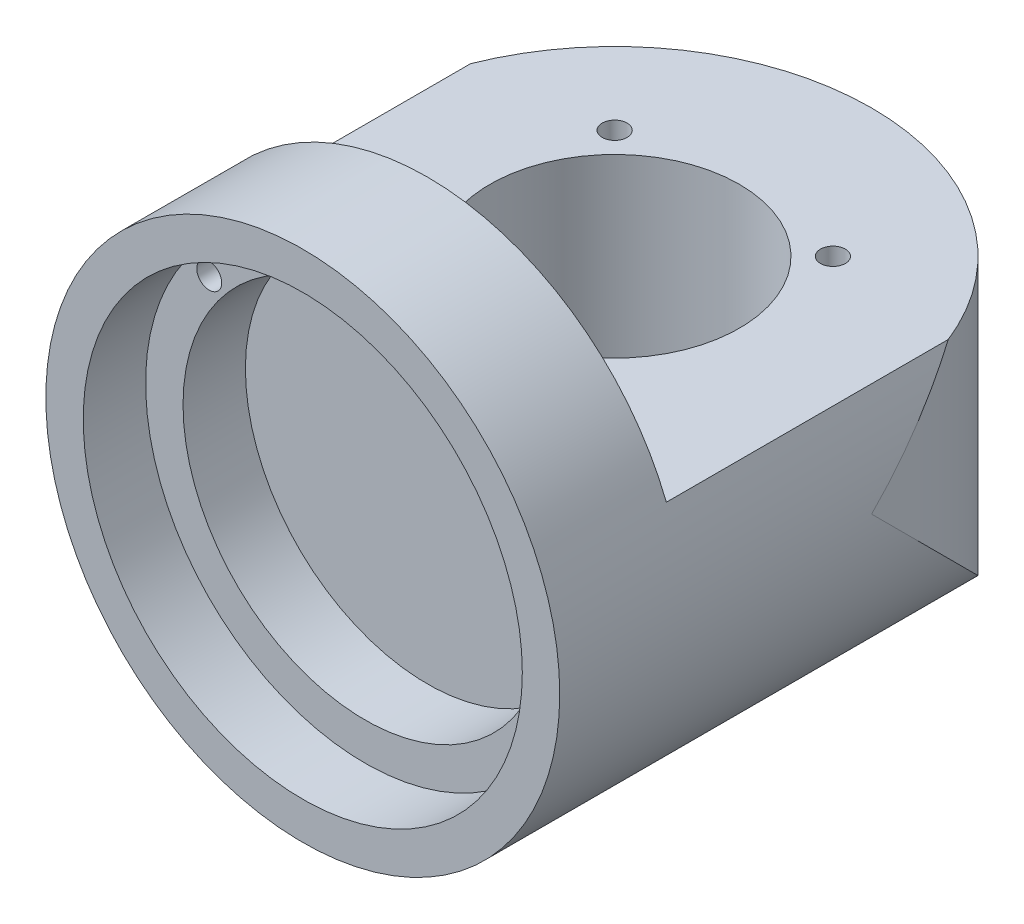
ISO-10303-21;
HEADER;
FILE_DESCRIPTION(('STEP AP214'),'2;1');
FILE_NAME('part.step','',(''),(''),'','','');
FILE_SCHEMA(('AUTOMOTIVE_DESIGN { 1 0 10303 214 1 1 1 1 }'));
ENDSEC;
DATA;
#1=APPLICATION_CONTEXT('core data for automotive mechanical design processes');
#2=APPLICATION_PROTOCOL_DEFINITION('international standard','automotive_design',2000,#1);
#3=PRODUCT_CONTEXT('',#1,'mechanical');
#4=PRODUCT('Part','Part','',(#3));
#5=PRODUCT_RELATED_PRODUCT_CATEGORY('part','',(#4));
#6=PRODUCT_DEFINITION_FORMATION('','',#4);
#7=PRODUCT_DEFINITION_CONTEXT('part definition',#1,'design');
#8=PRODUCT_DEFINITION('design','',#6,#7);
#9=PRODUCT_DEFINITION_SHAPE('','',#8);
#10=(LENGTH_UNIT() NAMED_UNIT(*) SI_UNIT(.MILLI.,.METRE.));
#11=(NAMED_UNIT(*) PLANE_ANGLE_UNIT() SI_UNIT($,.RADIAN.));
#12=(NAMED_UNIT(*) SI_UNIT($,.STERADIAN.) SOLID_ANGLE_UNIT());
#13=UNCERTAINTY_MEASURE_WITH_UNIT(LENGTH_MEASURE(1.E-05),#10,'distance_accuracy_value','');
#14=(GEOMETRIC_REPRESENTATION_CONTEXT(3) GLOBAL_UNCERTAINTY_ASSIGNED_CONTEXT((#13)) GLOBAL_UNIT_ASSIGNED_CONTEXT((#10,
#11,#12)) REPRESENTATION_CONTEXT('',''));
#15=CARTESIAN_POINT('',(0.,0.,0.));
#16=DIRECTION('',(0.,0.,1.));
#17=DIRECTION('',(1.,0.,0.));
#18=AXIS2_PLACEMENT_3D('',#15,#16,#17);
#19=CARTESIAN_POINT('',(0.,0.,0.));
#20=DIRECTION('',(0.,0.,1.));
#21=DIRECTION('',(1.,0.,0.));
#22=AXIS2_PLACEMENT_3D('',#19,#20,#21);
#23=PLANE('',#22);
#24=CARTESIAN_POINT('',(-25.,20.,0.));
#25=DIRECTION('',(0.,0.,1.));
#26=DIRECTION('',(1.,0.,0.));
#27=AXIS2_PLACEMENT_3D('',#24,#25,#26);
#28=CIRCLE('',#27,2.);
#29=CARTESIAN_POINT('',(-23.,20.,0.));
#30=VERTEX_POINT('',#29);
#31=EDGE_CURVE('E179',#30,#30,#28,.T.);
#32=ORIENTED_EDGE('',*,*,#31,.T.);
#33=EDGE_LOOP('',(#32));
#34=FACE_BOUND('',#33,.T.);
#35=CARTESIAN_POINT('',(25.,20.,0.));
#36=DIRECTION('',(0.,0.,1.));
#37=DIRECTION('',(1.,0.,0.));
#38=AXIS2_PLACEMENT_3D('',#35,#36,#37);
#39=CIRCLE('',#38,2.);
#40=CARTESIAN_POINT('',(27.,20.,0.));
#41=VERTEX_POINT('',#40);
#42=EDGE_CURVE('E176',#41,#41,#39,.T.);
#43=ORIENTED_EDGE('',*,*,#42,.T.);
#44=EDGE_LOOP('',(#43));
#45=FACE_BOUND('',#44,.T.);
#46=CARTESIAN_POINT('',(17.,28.,0.));
#47=DIRECTION('',(0.,0.,1.));
#48=DIRECTION('',(1.,0.,0.));
#49=AXIS2_PLACEMENT_3D('',#46,#47,#48);
#50=CIRCLE('',#49,2.);
#51=CARTESIAN_POINT('',(19.,28.,0.));
#52=VERTEX_POINT('',#51);
#53=EDGE_CURVE('E170',#52,#52,#50,.T.);
#54=ORIENTED_EDGE('',*,*,#53,.T.);
#55=EDGE_LOOP('',(#54));
#56=FACE_BOUND('',#55,.T.);
#57=CARTESIAN_POINT('',(-17.,28.,0.));
#58=DIRECTION('',(0.,0.,1.));
#59=DIRECTION('',(1.,0.,0.));
#60=AXIS2_PLACEMENT_3D('',#57,#58,#59);
#61=CIRCLE('',#60,2.);
#62=CARTESIAN_POINT('',(-15.,28.,0.));
#63=VERTEX_POINT('',#62);
#64=EDGE_CURVE('E163',#63,#63,#61,.T.);
#65=ORIENTED_EDGE('',*,*,#64,.T.);
#66=EDGE_LOOP('',(#65));
#67=FACE_BOUND('',#66,.T.);
#68=DIRECTION('',(1.,0.,0.));
#69=VECTOR('',#68,1.);
#70=CARTESIAN_POINT('',(0.,15.2,0.));
#71=LINE('',#70,#69);
#72=CARTESIAN_POINT('',(24.9319072675959,15.2,0.));
#73=VERTEX_POINT('',#72);
#74=CARTESIAN_POINT('',(38.2936025988676,15.2,0.));
#75=VERTEX_POINT('',#74);
#76=EDGE_CURVE('E93',#73,#75,#71,.T.);
#77=ORIENTED_EDGE('',*,*,#76,.F.);
#78=CARTESIAN_POINT('',(0.,0.,0.));
#79=DIRECTION('',(0.,0.,1.));
#80=DIRECTION('',(1.,0.,0.));
#81=AXIS2_PLACEMENT_3D('',#78,#79,#80);
#82=CIRCLE('',#81,29.2);
#83=CARTESIAN_POINT('',(-24.9319072675959,15.2,0.));
#84=VERTEX_POINT('',#83);
#85=EDGE_CURVE('E47',#73,#84,#82,.T.);
#86=ORIENTED_EDGE('',*,*,#85,.T.);
#87=CARTESIAN_POINT('',(-38.2936025988676,15.2,0.));
#88=VERTEX_POINT('',#87);
#89=EDGE_CURVE('E92',#88,#84,#71,.T.);
#90=ORIENTED_EDGE('',*,*,#89,.F.);
#91=CARTESIAN_POINT('',(0.,0.,0.));
#92=DIRECTION('',(0.,0.,1.));
#93=DIRECTION('',(1.,0.,0.));
#94=AXIS2_PLACEMENT_3D('',#91,#92,#93);
#95=CIRCLE('',#94,41.2);
#96=EDGE_CURVE('E117',#75,#88,#95,.T.);
#97=ORIENTED_EDGE('',*,*,#96,.F.);
#98=EDGE_LOOP('',(#77,#86,#90,#97));
#99=FACE_BOUND('',#98,.T.);
#100=ADVANCED_FACE('F33',(#34,#45,#56,#67,#99),#23,.F.);
#101=CARTESIAN_POINT('',(0.,0.,20.));
#102=DIRECTION('',(0.,0.,-1.));
#103=DIRECTION('',(-1.,0.,0.));
#104=AXIS2_PLACEMENT_3D('',#101,#102,#103);
#105=CYLINDRICAL_SURFACE('',#104,41.2);
#106=DIRECTION('',(0.,0.,1.));
#107=VECTOR('',#106,1.);
#108=CARTESIAN_POINT('',(38.2936025988676,15.2,-70.2));
#109=LINE('',#108,#107);
#110=CARTESIAN_POINT('',(38.2936025988676,15.2,-45.2));
#111=VERTEX_POINT('',#110);
#112=EDGE_CURVE('E41',#111,#75,#109,.T.);
#113=ORIENTED_EDGE('',*,*,#112,.T.);
#114=ORIENTED_EDGE('',*,*,#96,.T.);
#115=DIRECTION('',(0.,0.,1.));
#116=VECTOR('',#115,1.);
#117=CARTESIAN_POINT('',(-38.2936025988676,15.2,-70.2));
#118=LINE('',#117,#116);
#119=CARTESIAN_POINT('',(-38.2936025988676,15.2,-45.2000000000001));
#120=VERTEX_POINT('',#119);
#121=EDGE_CURVE('E12',#88,#120,#118,.F.);
#122=ORIENTED_EDGE('',*,*,#121,.T.);
#123=CARTESIAN_POINT('',(0.,0.,-30.));
#124=DIRECTION('',(0.,0.707106781186547,0.707106781186547));
#125=DIRECTION('',(0.,0.707106781186547,-0.707106781186547));
#126=AXIS2_PLACEMENT_3D('',#123,#124,#125);
#127=ELLIPSE('',#126,58.2655987697715,41.2);
#128=CARTESIAN_POINT('',(-41.2,0.,-30.));
#129=VERTEX_POINT('',#128);
#130=EDGE_CURVE('E138',#120,#129,#127,.T.);
#131=ORIENTED_EDGE('',*,*,#130,.T.);
#132=CARTESIAN_POINT('',(0.,0.,-30.));
#133=DIRECTION('',(0.,0.707106781186547,-0.707106781186547));
#134=DIRECTION('',(0.,0.707106781186547,0.707106781186547));
#135=AXIS2_PLACEMENT_3D('',#132,#133,#134);
#136=ELLIPSE('',#135,58.2655987697715,41.2);
#137=CARTESIAN_POINT('',(-25.7021399887247,-32.2,-62.2));
#138=VERTEX_POINT('',#137);
#139=EDGE_CURVE('E128',#129,#138,#136,.F.);
#140=ORIENTED_EDGE('',*,*,#139,.T.);
#141=DIRECTION('',(0.,0.,1.));
#142=VECTOR('',#141,1.);
#143=CARTESIAN_POINT('',(-25.7021399887247,-32.2,-70.2));
#144=LINE('',#143,#142);
#145=CARTESIAN_POINT('',(-25.7021399887247,-32.2,0.));
#146=VERTEX_POINT('',#145);
#147=EDGE_CURVE('E130',#146,#138,#144,.F.);
#148=ORIENTED_EDGE('',*,*,#147,.F.);
#149=CARTESIAN_POINT('',(25.7021399887247,-32.2,0.));
#150=VERTEX_POINT('',#149);
#151=EDGE_CURVE('E121',#146,#150,#95,.T.);
#152=ORIENTED_EDGE('',*,*,#151,.T.);
#153=DIRECTION('',(0.,0.,1.));
#154=VECTOR('',#153,1.);
#155=CARTESIAN_POINT('',(25.7021399887247,-32.2,-70.2));
#156=LINE('',#155,#154);
#157=CARTESIAN_POINT('',(25.7021399887247,-32.2,-62.2));
#158=VERTEX_POINT('',#157);
#159=EDGE_CURVE('E136',#158,#150,#156,.T.);
#160=ORIENTED_EDGE('',*,*,#159,.F.);
#161=CARTESIAN_POINT('',(41.2,0.,-30.));
#162=VERTEX_POINT('',#161);
#163=EDGE_CURVE('E132',#158,#162,#136,.F.);
#164=ORIENTED_EDGE('',*,*,#163,.T.);
#165=EDGE_CURVE('E55',#162,#111,#127,.T.);
#166=ORIENTED_EDGE('',*,*,#165,.T.);
#167=EDGE_LOOP('',(#113,#114,#122,#131,#140,#148,#152,#160,#164,#166));
#168=FACE_BOUND('',#167,.T.);
#169=CARTESIAN_POINT('',(0.,0.,20.));
#170=DIRECTION('',(0.,0.,1.));
#171=DIRECTION('',(1.,0.,0.));
#172=AXIS2_PLACEMENT_3D('',#169,#170,#171);
#173=CIRCLE('',#172,41.2);
#174=CARTESIAN_POINT('',(41.2,0.,20.));
#175=VERTEX_POINT('',#174);
#176=EDGE_CURVE('E110',#175,#175,#173,.T.);
#177=ORIENTED_EDGE('',*,*,#176,.F.);
#178=EDGE_LOOP('',(#177));
#179=FACE_BOUND('',#178,.T.);
#180=ADVANCED_FACE('F35',(#168,#179),#105,.T.);
#181=CARTESIAN_POINT('',(0.,0.,20.));
#182=DIRECTION('',(0.,0.,1.));
#183=DIRECTION('',(1.,0.,0.));
#184=AXIS2_PLACEMENT_3D('',#181,#182,#183);
#185=PLANE('',#184);
#186=CARTESIAN_POINT('',(0.,0.,20.));
#187=DIRECTION('',(0.,0.,1.));
#188=DIRECTION('',(1.,0.,0.));
#189=AXIS2_PLACEMENT_3D('',#186,#187,#188);
#190=CIRCLE('',#189,35.2);
#191=CARTESIAN_POINT('',(35.2,0.,20.));
#192=VERTEX_POINT('',#191);
#193=EDGE_CURVE('E103',#192,#192,#190,.T.);
#194=ORIENTED_EDGE('',*,*,#193,.F.);
#195=EDGE_LOOP('',(#194));
#196=FACE_BOUND('',#195,.T.);
#197=ORIENTED_EDGE('',*,*,#176,.T.);
#198=EDGE_LOOP('',(#197));
#199=FACE_BOUND('',#198,.T.);
#200=ADVANCED_FACE('F327',(#196,#199),#185,.T.);
#201=ORIENTED_EDGE('',*,*,#151,.F.);
#202=DIRECTION('',(1.,0.,0.));
#203=VECTOR('',#202,1.);
#204=CARTESIAN_POINT('',(0.,-32.2,0.));
#205=LINE('',#204,#203);
#206=EDGE_CURVE('E108',#146,#150,#205,.T.);
#207=ORIENTED_EDGE('',*,*,#206,.T.);
#208=EDGE_LOOP('',(#201,#207));
#209=FACE_BOUND('',#208,.T.);
#210=ADVANCED_FACE('F323',(#209),#23,.F.);
#211=CARTESIAN_POINT('',(0.,-32.2,-30.));
#212=DIRECTION('',(0.,1.,0.));
#213=DIRECTION('',(0.,0.,1.));
#214=AXIS2_PLACEMENT_3D('',#211,#212,#213);
#215=CYLINDRICAL_SURFACE('',#214,41.2);
#216=ORIENTED_EDGE('',*,*,#130,.F.);
#217=CARTESIAN_POINT('',(0.,15.2,-30.));
#218=DIRECTION('',(0.,1.,0.));
#219=DIRECTION('',(0.,0.,1.));
#220=AXIS2_PLACEMENT_3D('',#217,#218,#219);
#221=CIRCLE('',#220,41.2);
#222=EDGE_CURVE('E123',#111,#120,#221,.T.);
#223=ORIENTED_EDGE('',*,*,#222,.F.);
#224=ORIENTED_EDGE('',*,*,#165,.F.);
#225=ORIENTED_EDGE('',*,*,#163,.F.);
#226=CARTESIAN_POINT('',(0.,-32.2,-30.));
#227=DIRECTION('',(0.,1.,0.));
#228=DIRECTION('',(0.,0.,1.));
#229=AXIS2_PLACEMENT_3D('',#226,#227,#228);
#230=CIRCLE('',#229,41.2);
#231=EDGE_CURVE('E119',#158,#138,#230,.T.);
#232=ORIENTED_EDGE('',*,*,#231,.T.);
#233=ORIENTED_EDGE('',*,*,#139,.F.);
#234=EDGE_LOOP('',(#216,#223,#224,#225,#232,#233));
#235=FACE_BOUND('',#234,.T.);
#236=ADVANCED_FACE('F331',(#235),#215,.T.);
#237=CARTESIAN_POINT('',(0.,-32.2,0.));
#238=DIRECTION('',(0.,1.,0.));
#239=DIRECTION('',(0.,0.,1.));
#240=AXIS2_PLACEMENT_3D('',#237,#238,#239);
#241=PLANE('',#240);
#242=CARTESIAN_POINT('',(1.96023752785379E-13,-32.2,-48.));
#243=DIRECTION('',(0.,-1.,0.));
#244=DIRECTION('',(0.,0.,-1.));
#245=AXIS2_PLACEMENT_3D('',#242,#243,#244);
#246=CIRCLE('',#245,2.);
#247=CARTESIAN_POINT('',(1.96023752785379E-13,-32.2,-50.));
#248=VERTEX_POINT('',#247);
#249=EDGE_CURVE('E227',#248,#248,#246,.T.);
#250=ORIENTED_EDGE('',*,*,#249,.F.);
#251=EDGE_LOOP('',(#250));
#252=FACE_BOUND('',#251,.T.);
#253=CARTESIAN_POINT('',(-12.7279220613577,-32.2,-42.727922061358));
#254=DIRECTION('',(0.,-1.,0.));
#255=DIRECTION('',(0.,0.,-1.));
#256=AXIS2_PLACEMENT_3D('',#253,#254,#255);
#257=CIRCLE('',#256,2.);
#258=CARTESIAN_POINT('',(-12.7279220613577,-32.2,-44.727922061358));
#259=VERTEX_POINT('',#258);
#260=EDGE_CURVE('E221',#259,#259,#257,.T.);
#261=ORIENTED_EDGE('',*,*,#260,.F.);
#262=EDGE_LOOP('',(#261));
#263=FACE_BOUND('',#262,.T.);
#264=CARTESIAN_POINT('',(-18.,-32.2,-30.0000000000002));
#265=DIRECTION('',(0.,-1.,0.));
#266=DIRECTION('',(0.,0.,-1.));
#267=AXIS2_PLACEMENT_3D('',#264,#265,#266);
#268=CIRCLE('',#267,2.);
#269=CARTESIAN_POINT('',(-18.,-32.2,-32.0000000000002));
#270=VERTEX_POINT('',#269);
#271=EDGE_CURVE('E215',#270,#270,#268,.T.);
#272=ORIENTED_EDGE('',*,*,#271,.F.);
#273=EDGE_LOOP('',(#272));
#274=FACE_BOUND('',#273,.T.);
#275=CARTESIAN_POINT('',(-12.727922061358,-32.2,-17.2720779386423));
#276=DIRECTION('',(0.,-1.,0.));
#277=DIRECTION('',(0.,0.,-1.));
#278=AXIS2_PLACEMENT_3D('',#275,#276,#277);
#279=CIRCLE('',#278,2.);
#280=CARTESIAN_POINT('',(-12.727922061358,-32.2,-19.2720779386423));
#281=VERTEX_POINT('',#280);
#282=EDGE_CURVE('E209',#281,#281,#279,.T.);
#283=ORIENTED_EDGE('',*,*,#282,.F.);
#284=EDGE_LOOP('',(#283));
#285=FACE_BOUND('',#284,.T.);
#286=CARTESIAN_POINT('',(-2.09901540593194E-13,-32.2,-12.));
#287=DIRECTION('',(0.,-1.,0.));
#288=DIRECTION('',(0.,0.,-1.));
#289=AXIS2_PLACEMENT_3D('',#286,#287,#288);
#290=CIRCLE('',#289,2.);
#291=CARTESIAN_POINT('',(-2.09901540593194E-13,-32.2,-14.));
#292=VERTEX_POINT('',#291);
#293=EDGE_CURVE('E203',#292,#292,#290,.T.);
#294=ORIENTED_EDGE('',*,*,#293,.F.);
#295=EDGE_LOOP('',(#294));
#296=FACE_BOUND('',#295,.T.);
#297=CARTESIAN_POINT('',(12.7279220613577,-32.2,-17.272077938642));
#298=DIRECTION('',(0.,-1.,0.));
#299=DIRECTION('',(0.,0.,-1.));
#300=AXIS2_PLACEMENT_3D('',#297,#298,#299);
#301=CIRCLE('',#300,2.);
#302=CARTESIAN_POINT('',(12.7279220613577,-32.2,-19.272077938642));
#303=VERTEX_POINT('',#302);
#304=EDGE_CURVE('E197',#303,#303,#301,.T.);
#305=ORIENTED_EDGE('',*,*,#304,.F.);
#306=EDGE_LOOP('',(#305));
#307=FACE_BOUND('',#306,.T.);
#308=CARTESIAN_POINT('',(12.727922061358,-32.2,-42.7279220613577));
#309=DIRECTION('',(0.,-1.,0.));
#310=DIRECTION('',(0.,0.,-1.));
#311=AXIS2_PLACEMENT_3D('',#308,#309,#310);
#312=CIRCLE('',#311,2.);
#313=CARTESIAN_POINT('',(12.727922061358,-32.2,-44.7279220613577));
#314=VERTEX_POINT('',#313);
#315=EDGE_CURVE('E191',#314,#314,#312,.T.);
#316=ORIENTED_EDGE('',*,*,#315,.F.);
#317=EDGE_LOOP('',(#316));
#318=FACE_BOUND('',#317,.T.);
#319=CARTESIAN_POINT('',(18.,-32.2,-29.9999999999998));
#320=DIRECTION('',(0.,-1.,0.));
#321=DIRECTION('',(0.,0.,-1.));
#322=AXIS2_PLACEMENT_3D('',#319,#320,#321);
#323=CIRCLE('',#322,2.);
#324=CARTESIAN_POINT('',(18.,-32.2,-31.9999999999998));
#325=VERTEX_POINT('',#324);
#326=EDGE_CURVE('E184',#325,#325,#323,.T.);
#327=ORIENTED_EDGE('',*,*,#326,.F.);
#328=EDGE_LOOP('',(#327));
#329=FACE_BOUND('',#328,.T.);
#330=CARTESIAN_POINT('',(0.,-32.2,-30.));
#331=DIRECTION('',(0.,1.,0.));
#332=DIRECTION('',(0.,0.,1.));
#333=AXIS2_PLACEMENT_3D('',#330,#331,#332);
#334=CIRCLE('',#333,15.7);
#335=CARTESIAN_POINT('',(0.,-32.2,-14.3));
#336=VERTEX_POINT('',#335);
#337=EDGE_CURVE('E144',#336,#336,#334,.T.);
#338=ORIENTED_EDGE('',*,*,#337,.T.);
#339=EDGE_LOOP('',(#338));
#340=FACE_BOUND('',#339,.T.);
#341=ORIENTED_EDGE('',*,*,#206,.F.);
#342=ORIENTED_EDGE('',*,*,#147,.T.);
#343=ORIENTED_EDGE('',*,*,#231,.F.);
#344=ORIENTED_EDGE('',*,*,#159,.T.);
#345=EDGE_LOOP('',(#341,#342,#343,#344));
#346=FACE_BOUND('',#345,.T.);
#347=ADVANCED_FACE('F304',(#252,#263,#274,#285,#296,#307,#318,#329,#340,#346),#241,.F.);
#348=CARTESIAN_POINT('',(0.,15.2,0.));
#349=DIRECTION('',(0.,1.,0.));
#350=DIRECTION('',(0.,0.,1.));
#351=AXIS2_PLACEMENT_3D('',#348,#349,#350);
#352=PLANE('',#351);
#353=CARTESIAN_POINT('',(17.5,15.2,-47.5));
#354=DIRECTION('',(0.,1.,0.));
#355=DIRECTION('',(0.,0.,1.));
#356=AXIS2_PLACEMENT_3D('',#353,#354,#355);
#357=CIRCLE('',#356,2.);
#358=CARTESIAN_POINT('',(17.5,15.2,-45.5));
#359=VERTEX_POINT('',#358);
#360=EDGE_CURVE('E286',#359,#359,#357,.T.);
#361=ORIENTED_EDGE('',*,*,#360,.F.);
#362=EDGE_LOOP('',(#361));
#363=FACE_BOUND('',#362,.T.);
#364=CARTESIAN_POINT('',(-17.5,15.2,-47.5));
#365=DIRECTION('',(0.,1.,0.));
#366=DIRECTION('',(0.,0.,1.));
#367=AXIS2_PLACEMENT_3D('',#364,#365,#366);
#368=CIRCLE('',#367,2.);
#369=CARTESIAN_POINT('',(-17.5,15.2,-45.5));
#370=VERTEX_POINT('',#369);
#371=EDGE_CURVE('E283',#370,#370,#368,.T.);
#372=ORIENTED_EDGE('',*,*,#371,.F.);
#373=EDGE_LOOP('',(#372));
#374=FACE_BOUND('',#373,.T.);
#375=CARTESIAN_POINT('',(0.,15.2,-30.));
#376=DIRECTION('',(0.,1.,0.));
#377=DIRECTION('',(0.,0.,1.));
#378=AXIS2_PLACEMENT_3D('',#375,#376,#377);
#379=CIRCLE('',#378,20.);
#380=CARTESIAN_POINT('',(0.,15.2,-9.99999999999999));
#381=VERTEX_POINT('',#380);
#382=EDGE_CURVE('E141',#381,#381,#379,.T.);
#383=ORIENTED_EDGE('',*,*,#382,.F.);
#384=EDGE_LOOP('',(#383));
#385=FACE_BOUND('',#384,.T.);
#386=ORIENTED_EDGE('',*,*,#121,.F.);
#387=ORIENTED_EDGE('',*,*,#89,.T.);
#388=EDGE_CURVE('E86',#84,#73,#71,.T.);
#389=ORIENTED_EDGE('',*,*,#388,.T.);
#390=ORIENTED_EDGE('',*,*,#76,.T.);
#391=ORIENTED_EDGE('',*,*,#112,.F.);
#392=ORIENTED_EDGE('',*,*,#222,.T.);
#393=EDGE_LOOP('',(#386,#387,#389,#390,#391,#392));
#394=FACE_BOUND('',#393,.T.);
#395=ADVANCED_FACE('F104',(#363,#374,#385,#394),#352,.T.);
#396=CARTESIAN_POINT('',(0.,-28.6,-30.));
#397=DIRECTION('',(0.,1.,0.));
#398=DIRECTION('',(0.,0.,1.));
#399=AXIS2_PLACEMENT_3D('',#396,#397,#398);
#400=CYLINDRICAL_SURFACE('',#399,20.);
#401=CARTESIAN_POINT('',(0.,-28.6,-30.));
#402=DIRECTION('',(0.,1.,0.));
#403=DIRECTION('',(0.,0.,1.));
#404=AXIS2_PLACEMENT_3D('',#401,#402,#403);
#405=CIRCLE('',#404,20.);
#406=CARTESIAN_POINT('',(0.,-28.6,-9.99999999999999));
#407=VERTEX_POINT('',#406);
#408=EDGE_CURVE('E140',#407,#407,#405,.T.);
#409=ORIENTED_EDGE('',*,*,#408,.F.);
#410=EDGE_LOOP('',(#409));
#411=FACE_BOUND('',#410,.T.);
#412=ORIENTED_EDGE('',*,*,#382,.T.);
#413=EDGE_LOOP('',(#412));
#414=FACE_BOUND('',#413,.T.);
#415=ADVANCED_FACE('F303',(#411,#414),#400,.F.);
#416=CARTESIAN_POINT('',(0.,-28.6,-30.));
#417=DIRECTION('',(0.,1.,0.));
#418=DIRECTION('',(0.,0.,1.));
#419=AXIS2_PLACEMENT_3D('',#416,#417,#418);
#420=PLANE('',#419);
#421=CARTESIAN_POINT('',(3.3133218391157E-13,-28.6,-48.));
#422=DIRECTION('',(0.,-1.,0.));
#423=DIRECTION('',(0.,0.,-1.));
#424=AXIS2_PLACEMENT_3D('',#421,#422,#423);
#425=CIRCLE('',#424,0.800000000000001);
#426=CARTESIAN_POINT('',(3.3133218391157E-13,-28.6,-48.8));
#427=VERTEX_POINT('',#426);
#428=EDGE_CURVE('E188',#427,#427,#425,.T.);
#429=ORIENTED_EDGE('',*,*,#428,.T.);
#430=EDGE_LOOP('',(#429));
#431=FACE_BOUND('',#430,.T.);
#432=CARTESIAN_POINT('',(-18.,-28.6,-30.0000000000003));
#433=DIRECTION('',(0.,-1.,0.));
#434=DIRECTION('',(0.,0.,-1.));
#435=AXIS2_PLACEMENT_3D('',#432,#433,#434);
#436=CIRCLE('',#435,0.799999999999999);
#437=CARTESIAN_POINT('',(-18.,-28.6,-30.8000000000003));
#438=VERTEX_POINT('',#437);
#439=EDGE_CURVE('E272',#438,#438,#436,.T.);
#440=ORIENTED_EDGE('',*,*,#439,.T.);
#441=EDGE_LOOP('',(#440));
#442=FACE_BOUND('',#441,.T.);
#443=CARTESIAN_POINT('',(-12.7279220613576,-28.6,-42.7279220613581));
#444=DIRECTION('',(0.,-1.,0.));
#445=DIRECTION('',(0.,0.,-1.));
#446=AXIS2_PLACEMENT_3D('',#443,#444,#445);
#447=CIRCLE('',#446,0.800000000000001);
#448=CARTESIAN_POINT('',(-12.7279220613576,-28.6,-43.5279220613581));
#449=VERTEX_POINT('',#448);
#450=EDGE_CURVE('E266',#449,#449,#447,.T.);
#451=ORIENTED_EDGE('',*,*,#450,.T.);
#452=EDGE_LOOP('',(#451));
#453=FACE_BOUND('',#452,.T.);
#454=CARTESIAN_POINT('',(-12.7279220613581,-28.6,-17.2720779386424));
#455=DIRECTION('',(0.,-1.,0.));
#456=DIRECTION('',(0.,0.,-1.));
#457=AXIS2_PLACEMENT_3D('',#454,#455,#456);
#458=CIRCLE('',#457,0.8);
#459=CARTESIAN_POINT('',(-12.7279220613581,-28.6,-18.0720779386424));
#460=VERTEX_POINT('',#459);
#461=EDGE_CURVE('E260',#460,#460,#458,.T.);
#462=ORIENTED_EDGE('',*,*,#461,.T.);
#463=EDGE_LOOP('',(#462));
#464=FACE_BOUND('',#463,.T.);
#465=CARTESIAN_POINT('',(-3.27862736959617E-13,-28.6,-12.));
#466=DIRECTION('',(0.,-1.,0.));
#467=DIRECTION('',(0.,0.,-1.));
#468=AXIS2_PLACEMENT_3D('',#465,#466,#467);
#469=CIRCLE('',#468,0.8);
#470=CARTESIAN_POINT('',(-3.27862736959617E-13,-28.6,-12.8));
#471=VERTEX_POINT('',#470);
#472=EDGE_CURVE('E254',#471,#471,#469,.T.);
#473=ORIENTED_EDGE('',*,*,#472,.T.);
#474=EDGE_LOOP('',(#473));
#475=FACE_BOUND('',#474,.T.);
#476=CARTESIAN_POINT('',(12.7279220613576,-28.6,-17.2720779386419));
#477=DIRECTION('',(0.,-1.,0.));
#478=DIRECTION('',(0.,0.,-1.));
#479=AXIS2_PLACEMENT_3D('',#476,#477,#478);
#480=CIRCLE('',#479,0.8);
#481=CARTESIAN_POINT('',(12.7279220613576,-28.6,-18.0720779386419));
#482=VERTEX_POINT('',#481);
#483=EDGE_CURVE('E248',#482,#482,#480,.T.);
#484=ORIENTED_EDGE('',*,*,#483,.T.);
#485=EDGE_LOOP('',(#484));
#486=FACE_BOUND('',#485,.T.);
#487=CARTESIAN_POINT('',(12.7279220613581,-28.6,-42.7279220613576));
#488=DIRECTION('',(0.,-1.,0.));
#489=DIRECTION('',(0.,0.,-1.));
#490=AXIS2_PLACEMENT_3D('',#487,#488,#489);
#491=CIRCLE('',#490,0.800000000000001);
#492=CARTESIAN_POINT('',(12.7279220613581,-28.6,-43.5279220613576));
#493=VERTEX_POINT('',#492);
#494=EDGE_CURVE('E242',#493,#493,#491,.T.);
#495=ORIENTED_EDGE('',*,*,#494,.T.);
#496=EDGE_LOOP('',(#495));
#497=FACE_BOUND('',#496,.T.);
#498=CARTESIAN_POINT('',(18.,-28.6,-29.9999999999997));
#499=DIRECTION('',(0.,-1.,0.));
#500=DIRECTION('',(0.,0.,-1.));
#501=AXIS2_PLACEMENT_3D('',#498,#499,#500);
#502=CIRCLE('',#501,0.799999999999999);
#503=CARTESIAN_POINT('',(18.,-28.6,-30.7999999999997));
#504=VERTEX_POINT('',#503);
#505=EDGE_CURVE('E235',#504,#504,#502,.T.);
#506=ORIENTED_EDGE('',*,*,#505,.T.);
#507=EDGE_LOOP('',(#506));
#508=FACE_BOUND('',#507,.T.);
#509=CARTESIAN_POINT('',(0.,-28.6,-30.));
#510=DIRECTION('',(0.,1.,0.));
#511=DIRECTION('',(0.,0.,1.));
#512=AXIS2_PLACEMENT_3D('',#509,#510,#511);
#513=CIRCLE('',#512,15.7);
#514=CARTESIAN_POINT('',(0.,-28.6,-14.3));
#515=VERTEX_POINT('',#514);
#516=EDGE_CURVE('E147',#515,#515,#513,.T.);
#517=ORIENTED_EDGE('',*,*,#516,.F.);
#518=EDGE_LOOP('',(#517));
#519=FACE_BOUND('',#518,.T.);
#520=ORIENTED_EDGE('',*,*,#408,.T.);
#521=EDGE_LOOP('',(#520));
#522=FACE_BOUND('',#521,.T.);
#523=ADVANCED_FACE('F311',(#431,#442,#453,#464,#475,#486,#497,#508,#519,#522),#420,.T.);
#524=CARTESIAN_POINT('',(0.,-32.2,-30.));
#525=DIRECTION('',(0.,1.,0.));
#526=DIRECTION('',(0.,0.,1.));
#527=AXIS2_PLACEMENT_3D('',#524,#525,#526);
#528=CYLINDRICAL_SURFACE('',#527,15.7);
#529=ORIENTED_EDGE('',*,*,#337,.F.);
#530=EDGE_LOOP('',(#529));
#531=FACE_BOUND('',#530,.T.);
#532=ORIENTED_EDGE('',*,*,#516,.T.);
#533=EDGE_LOOP('',(#532));
#534=FACE_BOUND('',#533,.T.);
#535=ADVANCED_FACE('F317',(#531,#534),#528,.F.);
#536=CARTESIAN_POINT('',(0.,0.,10.));
#537=DIRECTION('',(0.,0.,1.));
#538=DIRECTION('',(1.,0.,0.));
#539=AXIS2_PLACEMENT_3D('',#536,#537,#538);
#540=CYLINDRICAL_SURFACE('',#539,35.2);
#541=CARTESIAN_POINT('',(0.,0.,10.));
#542=DIRECTION('',(0.,0.,1.));
#543=DIRECTION('',(1.,0.,0.));
#544=AXIS2_PLACEMENT_3D('',#541,#542,#543);
#545=CIRCLE('',#544,35.2);
#546=CARTESIAN_POINT('',(35.2,0.,10.));
#547=VERTEX_POINT('',#546);
#548=EDGE_CURVE('E150',#547,#547,#545,.T.);
#549=ORIENTED_EDGE('',*,*,#548,.F.);
#550=EDGE_LOOP('',(#549));
#551=FACE_BOUND('',#550,.T.);
#552=ORIENTED_EDGE('',*,*,#193,.T.);
#553=EDGE_LOOP('',(#552));
#554=FACE_BOUND('',#553,.T.);
#555=ADVANCED_FACE('F371',(#551,#554),#540,.F.);
#556=CARTESIAN_POINT('',(0.,0.,10.));
#557=DIRECTION('',(0.,0.,1.));
#558=DIRECTION('',(1.,0.,0.));
#559=AXIS2_PLACEMENT_3D('',#556,#557,#558);
#560=PLANE('',#559);
#561=CARTESIAN_POINT('',(-25.,20.,10.));
#562=DIRECTION('',(0.,0.,1.));
#563=DIRECTION('',(1.,0.,0.));
#564=AXIS2_PLACEMENT_3D('',#561,#562,#563);
#565=CIRCLE('',#564,2.);
#566=CARTESIAN_POINT('',(-23.,20.,10.));
#567=VERTEX_POINT('',#566);
#568=EDGE_CURVE('E158',#567,#567,#565,.T.);
#569=ORIENTED_EDGE('',*,*,#568,.F.);
#570=EDGE_LOOP('',(#569));
#571=FACE_BOUND('',#570,.T.);
#572=CARTESIAN_POINT('',(25.,20.,10.));
#573=DIRECTION('',(0.,0.,1.));
#574=DIRECTION('',(1.,0.,0.));
#575=AXIS2_PLACEMENT_3D('',#572,#573,#574);
#576=CIRCLE('',#575,2.);
#577=CARTESIAN_POINT('',(27.,20.,10.));
#578=VERTEX_POINT('',#577);
#579=EDGE_CURVE('E173',#578,#578,#576,.T.);
#580=ORIENTED_EDGE('',*,*,#579,.F.);
#581=EDGE_LOOP('',(#580));
#582=FACE_BOUND('',#581,.T.);
#583=CARTESIAN_POINT('',(17.,28.,10.));
#584=DIRECTION('',(0.,0.,1.));
#585=DIRECTION('',(1.,0.,0.));
#586=AXIS2_PLACEMENT_3D('',#583,#584,#585);
#587=CIRCLE('',#586,2.);
#588=CARTESIAN_POINT('',(19.,28.,10.));
#589=VERTEX_POINT('',#588);
#590=EDGE_CURVE('E167',#589,#589,#587,.T.);
#591=ORIENTED_EDGE('',*,*,#590,.F.);
#592=EDGE_LOOP('',(#591));
#593=FACE_BOUND('',#592,.T.);
#594=CARTESIAN_POINT('',(-17.,28.,10.));
#595=DIRECTION('',(0.,0.,1.));
#596=DIRECTION('',(1.,0.,0.));
#597=AXIS2_PLACEMENT_3D('',#594,#595,#596);
#598=CIRCLE('',#597,2.);
#599=CARTESIAN_POINT('',(-15.,28.,10.));
#600=VERTEX_POINT('',#599);
#601=EDGE_CURVE('E160',#600,#600,#598,.T.);
#602=ORIENTED_EDGE('',*,*,#601,.F.);
#603=EDGE_LOOP('',(#602));
#604=FACE_BOUND('',#603,.T.);
#605=CARTESIAN_POINT('',(0.,0.,10.));
#606=DIRECTION('',(0.,0.,1.));
#607=DIRECTION('',(1.,0.,0.));
#608=AXIS2_PLACEMENT_3D('',#605,#606,#607);
#609=CIRCLE('',#608,29.2);
#610=CARTESIAN_POINT('',(29.2,0.,10.));
#611=VERTEX_POINT('',#610);
#612=EDGE_CURVE('E97',#611,#611,#609,.T.);
#613=ORIENTED_EDGE('',*,*,#612,.F.);
#614=EDGE_LOOP('',(#613));
#615=FACE_BOUND('',#614,.T.);
#616=ORIENTED_EDGE('',*,*,#548,.T.);
#617=EDGE_LOOP('',(#616));
#618=FACE_BOUND('',#617,.T.);
#619=ADVANCED_FACE('F379',(#571,#582,#593,#604,#615,#618),#560,.T.);
#620=CARTESIAN_POINT('',(0.,0.,0.));
#621=DIRECTION('',(0.,0.,1.));
#622=DIRECTION('',(1.,0.,0.));
#623=AXIS2_PLACEMENT_3D('',#620,#621,#622);
#624=CYLINDRICAL_SURFACE('',#623,29.2);
#625=ORIENTED_EDGE('',*,*,#85,.F.);
#626=EDGE_CURVE('E88',#84,#73,#82,.T.);
#627=ORIENTED_EDGE('',*,*,#626,.F.);
#628=EDGE_LOOP('',(#625,#627));
#629=FACE_BOUND('',#628,.T.);
#630=ORIENTED_EDGE('',*,*,#612,.T.);
#631=EDGE_LOOP('',(#630));
#632=FACE_BOUND('',#631,.T.);
#633=ADVANCED_FACE('F95',(#629,#632),#624,.F.);
#634=CARTESIAN_POINT('',(0.,0.,0.));
#635=DIRECTION('',(0.,0.,1.));
#636=DIRECTION('',(1.,0.,0.));
#637=AXIS2_PLACEMENT_3D('',#634,#635,#636);
#638=PLANE('',#637);
#639=ORIENTED_EDGE('',*,*,#626,.T.);
#640=ORIENTED_EDGE('',*,*,#388,.F.);
#641=EDGE_LOOP('',(#639,#640));
#642=FACE_BOUND('',#641,.T.);
#643=ADVANCED_FACE('F87',(#642),#638,.T.);
#644=CARTESIAN_POINT('',(-17.,28.,10.));
#645=DIRECTION('',(0.,0.,-1.));
#646=DIRECTION('',(-1.,0.,0.));
#647=AXIS2_PLACEMENT_3D('',#644,#645,#646);
#648=CYLINDRICAL_SURFACE('',#647,2.);
#649=ORIENTED_EDGE('',*,*,#601,.T.);
#650=EDGE_LOOP('',(#649));
#651=FACE_BOUND('',#650,.T.);
#652=ORIENTED_EDGE('',*,*,#64,.F.);
#653=EDGE_LOOP('',(#652));
#654=FACE_BOUND('',#653,.T.);
#655=ADVANCED_FACE('F390',(#651,#654),#648,.F.);
#656=CARTESIAN_POINT('',(17.,28.,10.));
#657=DIRECTION('',(0.,0.,-1.));
#658=DIRECTION('',(-1.,0.,0.));
#659=AXIS2_PLACEMENT_3D('',#656,#657,#658);
#660=CYLINDRICAL_SURFACE('',#659,2.);
#661=ORIENTED_EDGE('',*,*,#590,.T.);
#662=EDGE_LOOP('',(#661));
#663=FACE_BOUND('',#662,.T.);
#664=ORIENTED_EDGE('',*,*,#53,.F.);
#665=EDGE_LOOP('',(#664));
#666=FACE_BOUND('',#665,.T.);
#667=ADVANCED_FACE('F393',(#663,#666),#660,.F.);
#668=CARTESIAN_POINT('',(25.,20.,10.));
#669=DIRECTION('',(0.,0.,-1.));
#670=DIRECTION('',(-1.,0.,0.));
#671=AXIS2_PLACEMENT_3D('',#668,#669,#670);
#672=CYLINDRICAL_SURFACE('',#671,2.);
#673=ORIENTED_EDGE('',*,*,#579,.T.);
#674=EDGE_LOOP('',(#673));
#675=FACE_BOUND('',#674,.T.);
#676=ORIENTED_EDGE('',*,*,#42,.F.);
#677=EDGE_LOOP('',(#676));
#678=FACE_BOUND('',#677,.T.);
#679=ADVANCED_FACE('F397',(#675,#678),#672,.F.);
#680=CARTESIAN_POINT('',(-25.,20.,10.));
#681=DIRECTION('',(0.,0.,-1.));
#682=DIRECTION('',(-1.,0.,0.));
#683=AXIS2_PLACEMENT_3D('',#680,#681,#682);
#684=CYLINDRICAL_SURFACE('',#683,2.);
#685=ORIENTED_EDGE('',*,*,#568,.T.);
#686=EDGE_LOOP('',(#685));
#687=FACE_BOUND('',#686,.T.);
#688=ORIENTED_EDGE('',*,*,#31,.F.);
#689=EDGE_LOOP('',(#688));
#690=FACE_BOUND('',#689,.T.);
#691=ADVANCED_FACE('F401',(#687,#690),#684,.F.);
#692=CARTESIAN_POINT('',(18.,-30.1,-29.9999999999998));
#693=DIRECTION('',(0.,-1.,0.));
#694=DIRECTION('',(0.,0.,-1.));
#695=AXIS2_PLACEMENT_3D('',#692,#693,#694);
#696=CYLINDRICAL_SURFACE('',#695,2.);
#697=CARTESIAN_POINT('',(18.,-30.1,-29.9999999999998));
#698=DIRECTION('',(0.,-1.,0.));
#699=DIRECTION('',(0.,0.,-1.));
#700=AXIS2_PLACEMENT_3D('',#697,#698,#699);
#701=CIRCLE('',#700,2.);
#702=CARTESIAN_POINT('',(18.,-30.1,-31.9999999999998));
#703=VERTEX_POINT('',#702);
#704=EDGE_CURVE('E187',#703,#703,#701,.T.);
#705=ORIENTED_EDGE('',*,*,#704,.F.);
#706=EDGE_LOOP('',(#705));
#707=FACE_BOUND('',#706,.T.);
#708=ORIENTED_EDGE('',*,*,#326,.T.);
#709=EDGE_LOOP('',(#708));
#710=FACE_BOUND('',#709,.T.);
#711=ADVANCED_FACE('F405',(#707,#710),#696,.F.);
#712=CARTESIAN_POINT('',(18.,-30.1,-29.9999999999998));
#713=DIRECTION('',(0.,-1.,0.));
#714=DIRECTION('',(0.,0.,-1.));
#715=AXIS2_PLACEMENT_3D('',#712,#713,#714);
#716=PLANE('',#715);
#717=CARTESIAN_POINT('',(18.,-30.1,-29.9999999999997));
#718=DIRECTION('',(0.,-1.,0.));
#719=DIRECTION('',(0.,0.,-1.));
#720=AXIS2_PLACEMENT_3D('',#717,#718,#719);
#721=CIRCLE('',#720,0.799999999999999);
#722=CARTESIAN_POINT('',(18.,-30.1,-30.7999999999997));
#723=VERTEX_POINT('',#722);
#724=EDGE_CURVE('E232',#723,#723,#721,.T.);
#725=ORIENTED_EDGE('',*,*,#724,.F.);
#726=EDGE_LOOP('',(#725));
#727=FACE_BOUND('',#726,.T.);
#728=ORIENTED_EDGE('',*,*,#704,.T.);
#729=EDGE_LOOP('',(#728));
#730=FACE_BOUND('',#729,.T.);
#731=ADVANCED_FACE('F409',(#727,#730),#716,.T.);
#732=CARTESIAN_POINT('',(12.727922061358,-30.1,-42.7279220613577));
#733=DIRECTION('',(0.,-1.,0.));
#734=DIRECTION('',(0.,0.,-1.));
#735=AXIS2_PLACEMENT_3D('',#732,#733,#734);
#736=CYLINDRICAL_SURFACE('',#735,2.);
#737=CARTESIAN_POINT('',(12.727922061358,-30.1,-42.7279220613577));
#738=DIRECTION('',(0.,-1.,0.));
#739=DIRECTION('',(0.,0.,-1.));
#740=AXIS2_PLACEMENT_3D('',#737,#738,#739);
#741=CIRCLE('',#740,2.);
#742=CARTESIAN_POINT('',(12.727922061358,-30.1,-44.7279220613577));
#743=VERTEX_POINT('',#742);
#744=EDGE_CURVE('E194',#743,#743,#741,.T.);
#745=ORIENTED_EDGE('',*,*,#744,.F.);
#746=EDGE_LOOP('',(#745));
#747=FACE_BOUND('',#746,.T.);
#748=ORIENTED_EDGE('',*,*,#315,.T.);
#749=EDGE_LOOP('',(#748));
#750=FACE_BOUND('',#749,.T.);
#751=ADVANCED_FACE('F413',(#747,#750),#736,.F.);
#752=CARTESIAN_POINT('',(12.727922061358,-30.1,-42.7279220613577));
#753=DIRECTION('',(0.,-1.,0.));
#754=DIRECTION('',(0.,0.,-1.));
#755=AXIS2_PLACEMENT_3D('',#752,#753,#754);
#756=PLANE('',#755);
#757=CARTESIAN_POINT('',(12.7279220613581,-30.1,-42.7279220613576));
#758=DIRECTION('',(0.,-1.,0.));
#759=DIRECTION('',(0.,0.,-1.));
#760=AXIS2_PLACEMENT_3D('',#757,#758,#759);
#761=CIRCLE('',#760,0.800000000000001);
#762=CARTESIAN_POINT('',(12.7279220613581,-30.1,-43.5279220613576));
#763=VERTEX_POINT('',#762);
#764=EDGE_CURVE('E239',#763,#763,#761,.T.);
#765=ORIENTED_EDGE('',*,*,#764,.F.);
#766=EDGE_LOOP('',(#765));
#767=FACE_BOUND('',#766,.T.);
#768=ORIENTED_EDGE('',*,*,#744,.T.);
#769=EDGE_LOOP('',(#768));
#770=FACE_BOUND('',#769,.T.);
#771=ADVANCED_FACE('F417',(#767,#770),#756,.T.);
#772=CARTESIAN_POINT('',(12.7279220613577,-30.1,-17.272077938642));
#773=DIRECTION('',(0.,-1.,0.));
#774=DIRECTION('',(0.,0.,-1.));
#775=AXIS2_PLACEMENT_3D('',#772,#773,#774);
#776=CYLINDRICAL_SURFACE('',#775,2.);
#777=CARTESIAN_POINT('',(12.7279220613577,-30.1,-17.272077938642));
#778=DIRECTION('',(0.,-1.,0.));
#779=DIRECTION('',(0.,0.,-1.));
#780=AXIS2_PLACEMENT_3D('',#777,#778,#779);
#781=CIRCLE('',#780,2.);
#782=CARTESIAN_POINT('',(12.7279220613577,-30.1,-19.272077938642));
#783=VERTEX_POINT('',#782);
#784=EDGE_CURVE('E200',#783,#783,#781,.T.);
#785=ORIENTED_EDGE('',*,*,#784,.F.);
#786=EDGE_LOOP('',(#785));
#787=FACE_BOUND('',#786,.T.);
#788=ORIENTED_EDGE('',*,*,#304,.T.);
#789=EDGE_LOOP('',(#788));
#790=FACE_BOUND('',#789,.T.);
#791=ADVANCED_FACE('F421',(#787,#790),#776,.F.);
#792=CARTESIAN_POINT('',(12.7279220613577,-30.1,-17.272077938642));
#793=DIRECTION('',(0.,-1.,0.));
#794=DIRECTION('',(0.,0.,-1.));
#795=AXIS2_PLACEMENT_3D('',#792,#793,#794);
#796=PLANE('',#795);
#797=CARTESIAN_POINT('',(12.7279220613576,-30.1,-17.2720779386419));
#798=DIRECTION('',(0.,-1.,0.));
#799=DIRECTION('',(0.,0.,-1.));
#800=AXIS2_PLACEMENT_3D('',#797,#798,#799);
#801=CIRCLE('',#800,0.8);
#802=CARTESIAN_POINT('',(12.7279220613576,-30.1,-18.0720779386419));
#803=VERTEX_POINT('',#802);
#804=EDGE_CURVE('E245',#803,#803,#801,.T.);
#805=ORIENTED_EDGE('',*,*,#804,.F.);
#806=EDGE_LOOP('',(#805));
#807=FACE_BOUND('',#806,.T.);
#808=ORIENTED_EDGE('',*,*,#784,.T.);
#809=EDGE_LOOP('',(#808));
#810=FACE_BOUND('',#809,.T.);
#811=ADVANCED_FACE('F425',(#807,#810),#796,.T.);
#812=CARTESIAN_POINT('',(-2.09901540593194E-13,-30.1,-12.));
#813=DIRECTION('',(0.,-1.,0.));
#814=DIRECTION('',(0.,0.,-1.));
#815=AXIS2_PLACEMENT_3D('',#812,#813,#814);
#816=CYLINDRICAL_SURFACE('',#815,2.);
#817=CARTESIAN_POINT('',(-2.09901540593194E-13,-30.1,-12.));
#818=DIRECTION('',(0.,-1.,0.));
#819=DIRECTION('',(0.,0.,-1.));
#820=AXIS2_PLACEMENT_3D('',#817,#818,#819);
#821=CIRCLE('',#820,2.);
#822=CARTESIAN_POINT('',(-2.09901540593194E-13,-30.1,-14.));
#823=VERTEX_POINT('',#822);
#824=EDGE_CURVE('E206',#823,#823,#821,.T.);
#825=ORIENTED_EDGE('',*,*,#824,.F.);
#826=EDGE_LOOP('',(#825));
#827=FACE_BOUND('',#826,.T.);
#828=ORIENTED_EDGE('',*,*,#293,.T.);
#829=EDGE_LOOP('',(#828));
#830=FACE_BOUND('',#829,.T.);
#831=ADVANCED_FACE('F429',(#827,#830),#816,.F.);
#832=CARTESIAN_POINT('',(-2.09901540593194E-13,-30.1,-12.));
#833=DIRECTION('',(0.,-1.,0.));
#834=DIRECTION('',(0.,0.,-1.));
#835=AXIS2_PLACEMENT_3D('',#832,#833,#834);
#836=PLANE('',#835);
#837=CARTESIAN_POINT('',(-3.27862736959617E-13,-30.1,-12.));
#838=DIRECTION('',(0.,-1.,0.));
#839=DIRECTION('',(0.,0.,-1.));
#840=AXIS2_PLACEMENT_3D('',#837,#838,#839);
#841=CIRCLE('',#840,0.8);
#842=CARTESIAN_POINT('',(-3.27862736959617E-13,-30.1,-12.8));
#843=VERTEX_POINT('',#842);
#844=EDGE_CURVE('E251',#843,#843,#841,.T.);
#845=ORIENTED_EDGE('',*,*,#844,.F.);
#846=EDGE_LOOP('',(#845));
#847=FACE_BOUND('',#846,.T.);
#848=ORIENTED_EDGE('',*,*,#824,.T.);
#849=EDGE_LOOP('',(#848));
#850=FACE_BOUND('',#849,.T.);
#851=ADVANCED_FACE('F433',(#847,#850),#836,.T.);
#852=CARTESIAN_POINT('',(-12.727922061358,-30.1,-17.2720779386423));
#853=DIRECTION('',(0.,-1.,0.));
#854=DIRECTION('',(0.,0.,-1.));
#855=AXIS2_PLACEMENT_3D('',#852,#853,#854);
#856=CYLINDRICAL_SURFACE('',#855,2.);
#857=CARTESIAN_POINT('',(-12.727922061358,-30.1,-17.2720779386423));
#858=DIRECTION('',(0.,-1.,0.));
#859=DIRECTION('',(0.,0.,-1.));
#860=AXIS2_PLACEMENT_3D('',#857,#858,#859);
#861=CIRCLE('',#860,2.);
#862=CARTESIAN_POINT('',(-12.727922061358,-30.1,-19.2720779386423));
#863=VERTEX_POINT('',#862);
#864=EDGE_CURVE('E212',#863,#863,#861,.T.);
#865=ORIENTED_EDGE('',*,*,#864,.F.);
#866=EDGE_LOOP('',(#865));
#867=FACE_BOUND('',#866,.T.);
#868=ORIENTED_EDGE('',*,*,#282,.T.);
#869=EDGE_LOOP('',(#868));
#870=FACE_BOUND('',#869,.T.);
#871=ADVANCED_FACE('F437',(#867,#870),#856,.F.);
#872=CARTESIAN_POINT('',(-12.727922061358,-30.1,-17.2720779386423));
#873=DIRECTION('',(0.,-1.,0.));
#874=DIRECTION('',(0.,0.,-1.));
#875=AXIS2_PLACEMENT_3D('',#872,#873,#874);
#876=PLANE('',#875);
#877=CARTESIAN_POINT('',(-12.7279220613581,-30.1,-17.2720779386424));
#878=DIRECTION('',(0.,-1.,0.));
#879=DIRECTION('',(0.,0.,-1.));
#880=AXIS2_PLACEMENT_3D('',#877,#878,#879);
#881=CIRCLE('',#880,0.8);
#882=CARTESIAN_POINT('',(-12.7279220613581,-30.1,-18.0720779386424));
#883=VERTEX_POINT('',#882);
#884=EDGE_CURVE('E257',#883,#883,#881,.T.);
#885=ORIENTED_EDGE('',*,*,#884,.F.);
#886=EDGE_LOOP('',(#885));
#887=FACE_BOUND('',#886,.T.);
#888=ORIENTED_EDGE('',*,*,#864,.T.);
#889=EDGE_LOOP('',(#888));
#890=FACE_BOUND('',#889,.T.);
#891=ADVANCED_FACE('F441',(#887,#890),#876,.T.);
#892=CARTESIAN_POINT('',(-18.,-30.1,-30.0000000000002));
#893=DIRECTION('',(0.,-1.,0.));
#894=DIRECTION('',(0.,0.,-1.));
#895=AXIS2_PLACEMENT_3D('',#892,#893,#894);
#896=CYLINDRICAL_SURFACE('',#895,2.);
#897=CARTESIAN_POINT('',(-18.,-30.1,-30.0000000000002));
#898=DIRECTION('',(0.,-1.,0.));
#899=DIRECTION('',(0.,0.,-1.));
#900=AXIS2_PLACEMENT_3D('',#897,#898,#899);
#901=CIRCLE('',#900,2.);
#902=CARTESIAN_POINT('',(-18.,-30.1,-32.0000000000002));
#903=VERTEX_POINT('',#902);
#904=EDGE_CURVE('E218',#903,#903,#901,.T.);
#905=ORIENTED_EDGE('',*,*,#904,.F.);
#906=EDGE_LOOP('',(#905));
#907=FACE_BOUND('',#906,.T.);
#908=ORIENTED_EDGE('',*,*,#271,.T.);
#909=EDGE_LOOP('',(#908));
#910=FACE_BOUND('',#909,.T.);
#911=ADVANCED_FACE('F445',(#907,#910),#896,.F.);
#912=CARTESIAN_POINT('',(-18.,-30.1,-30.0000000000002));
#913=DIRECTION('',(0.,-1.,0.));
#914=DIRECTION('',(0.,0.,-1.));
#915=AXIS2_PLACEMENT_3D('',#912,#913,#914);
#916=PLANE('',#915);
#917=CARTESIAN_POINT('',(-18.,-30.1,-30.0000000000003));
#918=DIRECTION('',(0.,-1.,0.));
#919=DIRECTION('',(0.,0.,-1.));
#920=AXIS2_PLACEMENT_3D('',#917,#918,#919);
#921=CIRCLE('',#920,0.799999999999999);
#922=CARTESIAN_POINT('',(-18.,-30.1,-30.8000000000003));
#923=VERTEX_POINT('',#922);
#924=EDGE_CURVE('E269',#923,#923,#921,.T.);
#925=ORIENTED_EDGE('',*,*,#924,.F.);
#926=EDGE_LOOP('',(#925));
#927=FACE_BOUND('',#926,.T.);
#928=ORIENTED_EDGE('',*,*,#904,.T.);
#929=EDGE_LOOP('',(#928));
#930=FACE_BOUND('',#929,.T.);
#931=ADVANCED_FACE('F449',(#927,#930),#916,.T.);
#932=CARTESIAN_POINT('',(-12.7279220613577,-30.1,-42.727922061358));
#933=DIRECTION('',(0.,-1.,0.));
#934=DIRECTION('',(0.,0.,-1.));
#935=AXIS2_PLACEMENT_3D('',#932,#933,#934);
#936=CYLINDRICAL_SURFACE('',#935,2.);
#937=CARTESIAN_POINT('',(-12.7279220613577,-30.1,-42.727922061358));
#938=DIRECTION('',(0.,-1.,0.));
#939=DIRECTION('',(0.,0.,-1.));
#940=AXIS2_PLACEMENT_3D('',#937,#938,#939);
#941=CIRCLE('',#940,2.);
#942=CARTESIAN_POINT('',(-12.7279220613577,-30.1,-44.727922061358));
#943=VERTEX_POINT('',#942);
#944=EDGE_CURVE('E224',#943,#943,#941,.T.);
#945=ORIENTED_EDGE('',*,*,#944,.F.);
#946=EDGE_LOOP('',(#945));
#947=FACE_BOUND('',#946,.T.);
#948=ORIENTED_EDGE('',*,*,#260,.T.);
#949=EDGE_LOOP('',(#948));
#950=FACE_BOUND('',#949,.T.);
#951=ADVANCED_FACE('F453',(#947,#950),#936,.F.);
#952=CARTESIAN_POINT('',(-12.7279220613577,-30.1,-42.727922061358));
#953=DIRECTION('',(0.,-1.,0.));
#954=DIRECTION('',(0.,0.,-1.));
#955=AXIS2_PLACEMENT_3D('',#952,#953,#954);
#956=PLANE('',#955);
#957=CARTESIAN_POINT('',(-12.7279220613576,-30.1,-42.7279220613581));
#958=DIRECTION('',(0.,-1.,0.));
#959=DIRECTION('',(0.,0.,-1.));
#960=AXIS2_PLACEMENT_3D('',#957,#958,#959);
#961=CIRCLE('',#960,0.800000000000001);
#962=CARTESIAN_POINT('',(-12.7279220613576,-30.1,-43.5279220613581));
#963=VERTEX_POINT('',#962);
#964=EDGE_CURVE('E263',#963,#963,#961,.T.);
#965=ORIENTED_EDGE('',*,*,#964,.F.);
#966=EDGE_LOOP('',(#965));
#967=FACE_BOUND('',#966,.T.);
#968=ORIENTED_EDGE('',*,*,#944,.T.);
#969=EDGE_LOOP('',(#968));
#970=FACE_BOUND('',#969,.T.);
#971=ADVANCED_FACE('F457',(#967,#970),#956,.T.);
#972=CARTESIAN_POINT('',(1.96023752785379E-13,-30.1,-48.));
#973=DIRECTION('',(0.,-1.,0.));
#974=DIRECTION('',(0.,0.,-1.));
#975=AXIS2_PLACEMENT_3D('',#972,#973,#974);
#976=CYLINDRICAL_SURFACE('',#975,2.);
#977=CARTESIAN_POINT('',(1.96023752785379E-13,-30.1,-48.));
#978=DIRECTION('',(0.,-1.,0.));
#979=DIRECTION('',(0.,0.,-1.));
#980=AXIS2_PLACEMENT_3D('',#977,#978,#979);
#981=CIRCLE('',#980,2.);
#982=CARTESIAN_POINT('',(1.96023752785379E-13,-30.1,-50.));
#983=VERTEX_POINT('',#982);
#984=EDGE_CURVE('E164',#983,#983,#981,.T.);
#985=ORIENTED_EDGE('',*,*,#984,.F.);
#986=EDGE_LOOP('',(#985));
#987=FACE_BOUND('',#986,.T.);
#988=ORIENTED_EDGE('',*,*,#249,.T.);
#989=EDGE_LOOP('',(#988));
#990=FACE_BOUND('',#989,.T.);
#991=ADVANCED_FACE('F461',(#987,#990),#976,.F.);
#992=CARTESIAN_POINT('',(1.96023752785379E-13,-30.1,-48.));
#993=DIRECTION('',(0.,-1.,0.));
#994=DIRECTION('',(0.,0.,-1.));
#995=AXIS2_PLACEMENT_3D('',#992,#993,#994);
#996=PLANE('',#995);
#997=CARTESIAN_POINT('',(3.3133218391157E-13,-30.1,-48.));
#998=DIRECTION('',(0.,-1.,0.));
#999=DIRECTION('',(0.,0.,-1.));
#1000=AXIS2_PLACEMENT_3D('',#997,#998,#999);
#1001=CIRCLE('',#1000,0.800000000000001);
#1002=CARTESIAN_POINT('',(3.3133218391157E-13,-30.1,-48.8));
#1003=VERTEX_POINT('',#1002);
#1004=EDGE_CURVE('E275',#1003,#1003,#1001,.T.);
#1005=ORIENTED_EDGE('',*,*,#1004,.F.);
#1006=EDGE_LOOP('',(#1005));
#1007=FACE_BOUND('',#1006,.T.);
#1008=ORIENTED_EDGE('',*,*,#984,.T.);
#1009=EDGE_LOOP('',(#1008));
#1010=FACE_BOUND('',#1009,.T.);
#1011=ADVANCED_FACE('F465',(#1007,#1010),#996,.T.);
#1012=CARTESIAN_POINT('',(18.,-28.6,-29.9999999999997));
#1013=DIRECTION('',(0.,-1.,0.));
#1014=DIRECTION('',(0.,0.,-1.));
#1015=AXIS2_PLACEMENT_3D('',#1012,#1013,#1014);
#1016=CYLINDRICAL_SURFACE('',#1015,0.799999999999999);
#1017=ORIENTED_EDGE('',*,*,#505,.F.);
#1018=EDGE_LOOP('',(#1017));
#1019=FACE_BOUND('',#1018,.T.);
#1020=ORIENTED_EDGE('',*,*,#724,.T.);
#1021=EDGE_LOOP('',(#1020));
#1022=FACE_BOUND('',#1021,.T.);
#1023=ADVANCED_FACE('F469',(#1019,#1022),#1016,.F.);
#1024=CARTESIAN_POINT('',(12.7279220613581,-28.6,-42.7279220613576));
#1025=DIRECTION('',(0.,-1.,0.));
#1026=DIRECTION('',(0.,0.,-1.));
#1027=AXIS2_PLACEMENT_3D('',#1024,#1025,#1026);
#1028=CYLINDRICAL_SURFACE('',#1027,0.800000000000001);
#1029=ORIENTED_EDGE('',*,*,#494,.F.);
#1030=EDGE_LOOP('',(#1029));
#1031=FACE_BOUND('',#1030,.T.);
#1032=ORIENTED_EDGE('',*,*,#764,.T.);
#1033=EDGE_LOOP('',(#1032));
#1034=FACE_BOUND('',#1033,.T.);
#1035=ADVANCED_FACE('F473',(#1031,#1034),#1028,.F.);
#1036=CARTESIAN_POINT('',(12.7279220613576,-28.6,-17.2720779386419));
#1037=DIRECTION('',(0.,-1.,0.));
#1038=DIRECTION('',(0.,0.,-1.));
#1039=AXIS2_PLACEMENT_3D('',#1036,#1037,#1038);
#1040=CYLINDRICAL_SURFACE('',#1039,0.8);
#1041=ORIENTED_EDGE('',*,*,#483,.F.);
#1042=EDGE_LOOP('',(#1041));
#1043=FACE_BOUND('',#1042,.T.);
#1044=ORIENTED_EDGE('',*,*,#804,.T.);
#1045=EDGE_LOOP('',(#1044));
#1046=FACE_BOUND('',#1045,.T.);
#1047=ADVANCED_FACE('F477',(#1043,#1046),#1040,.F.);
#1048=CARTESIAN_POINT('',(-3.27862736959617E-13,-28.6,-12.));
#1049=DIRECTION('',(0.,-1.,0.));
#1050=DIRECTION('',(0.,0.,-1.));
#1051=AXIS2_PLACEMENT_3D('',#1048,#1049,#1050);
#1052=CYLINDRICAL_SURFACE('',#1051,0.8);
#1053=ORIENTED_EDGE('',*,*,#472,.F.);
#1054=EDGE_LOOP('',(#1053));
#1055=FACE_BOUND('',#1054,.T.);
#1056=ORIENTED_EDGE('',*,*,#844,.T.);
#1057=EDGE_LOOP('',(#1056));
#1058=FACE_BOUND('',#1057,.T.);
#1059=ADVANCED_FACE('F481',(#1055,#1058),#1052,.F.);
#1060=CARTESIAN_POINT('',(-12.7279220613581,-28.6,-17.2720779386424));
#1061=DIRECTION('',(0.,-1.,0.));
#1062=DIRECTION('',(0.,0.,-1.));
#1063=AXIS2_PLACEMENT_3D('',#1060,#1061,#1062);
#1064=CYLINDRICAL_SURFACE('',#1063,0.8);
#1065=ORIENTED_EDGE('',*,*,#461,.F.);
#1066=EDGE_LOOP('',(#1065));
#1067=FACE_BOUND('',#1066,.T.);
#1068=ORIENTED_EDGE('',*,*,#884,.T.);
#1069=EDGE_LOOP('',(#1068));
#1070=FACE_BOUND('',#1069,.T.);
#1071=ADVANCED_FACE('F485',(#1067,#1070),#1064,.F.);
#1072=CARTESIAN_POINT('',(-12.7279220613576,-28.6,-42.7279220613581));
#1073=DIRECTION('',(0.,-1.,0.));
#1074=DIRECTION('',(0.,0.,-1.));
#1075=AXIS2_PLACEMENT_3D('',#1072,#1073,#1074);
#1076=CYLINDRICAL_SURFACE('',#1075,0.800000000000001);
#1077=ORIENTED_EDGE('',*,*,#450,.F.);
#1078=EDGE_LOOP('',(#1077));
#1079=FACE_BOUND('',#1078,.T.);
#1080=ORIENTED_EDGE('',*,*,#964,.T.);
#1081=EDGE_LOOP('',(#1080));
#1082=FACE_BOUND('',#1081,.T.);
#1083=ADVANCED_FACE('F489',(#1079,#1082),#1076,.F.);
#1084=CARTESIAN_POINT('',(-18.,-28.6,-30.0000000000003));
#1085=DIRECTION('',(0.,-1.,0.));
#1086=DIRECTION('',(0.,0.,-1.));
#1087=AXIS2_PLACEMENT_3D('',#1084,#1085,#1086);
#1088=CYLINDRICAL_SURFACE('',#1087,0.799999999999999);
#1089=ORIENTED_EDGE('',*,*,#439,.F.);
#1090=EDGE_LOOP('',(#1089));
#1091=FACE_BOUND('',#1090,.T.);
#1092=ORIENTED_EDGE('',*,*,#924,.T.);
#1093=EDGE_LOOP('',(#1092));
#1094=FACE_BOUND('',#1093,.T.);
#1095=ADVANCED_FACE('F493',(#1091,#1094),#1088,.F.);
#1096=CARTESIAN_POINT('',(3.3133218391157E-13,-28.6,-48.));
#1097=DIRECTION('',(0.,-1.,0.));
#1098=DIRECTION('',(0.,0.,-1.));
#1099=AXIS2_PLACEMENT_3D('',#1096,#1097,#1098);
#1100=CYLINDRICAL_SURFACE('',#1099,0.800000000000001);
#1101=ORIENTED_EDGE('',*,*,#428,.F.);
#1102=EDGE_LOOP('',(#1101));
#1103=FACE_BOUND('',#1102,.T.);
#1104=ORIENTED_EDGE('',*,*,#1004,.T.);
#1105=EDGE_LOOP('',(#1104));
#1106=FACE_BOUND('',#1105,.T.);
#1107=ADVANCED_FACE('F497',(#1103,#1106),#1100,.F.);
#1108=CARTESIAN_POINT('',(-17.5,-24.8,-47.5));
#1109=DIRECTION('',(0.,1.,0.));
#1110=DIRECTION('',(0.,0.,1.));
#1111=AXIS2_PLACEMENT_3D('',#1108,#1109,#1110);
#1112=CYLINDRICAL_SURFACE('',#1111,2.);
#1113=CARTESIAN_POINT('',(-17.5,-24.8,-47.5));
#1114=DIRECTION('',(0.,1.,0.));
#1115=DIRECTION('',(0.,0.,1.));
#1116=AXIS2_PLACEMENT_3D('',#1113,#1114,#1115);
#1117=CIRCLE('',#1116,2.);
#1118=CARTESIAN_POINT('',(-17.5,-24.8,-45.5));
#1119=VERTEX_POINT('',#1118);
#1120=EDGE_CURVE('E280',#1119,#1119,#1117,.T.);
#1121=ORIENTED_EDGE('',*,*,#1120,.F.);
#1122=EDGE_LOOP('',(#1121));
#1123=FACE_BOUND('',#1122,.T.);
#1124=ORIENTED_EDGE('',*,*,#371,.T.);
#1125=EDGE_LOOP('',(#1124));
#1126=FACE_BOUND('',#1125,.T.);
#1127=ADVANCED_FACE('F501',(#1123,#1126),#1112,.F.);
#1128=CARTESIAN_POINT('',(-17.5,-24.8,-47.5));
#1129=DIRECTION('',(0.,1.,0.));
#1130=DIRECTION('',(0.,0.,1.));
#1131=AXIS2_PLACEMENT_3D('',#1128,#1129,#1130);
#1132=PLANE('',#1131);
#1133=ORIENTED_EDGE('',*,*,#1120,.T.);
#1134=EDGE_LOOP('',(#1133));
#1135=FACE_BOUND('',#1134,.T.);
#1136=ADVANCED_FACE('F297',(#1135),#1132,.T.);
#1137=CARTESIAN_POINT('',(17.5,-24.8,-47.5));
#1138=DIRECTION('',(0.,1.,0.));
#1139=DIRECTION('',(0.,0.,1.));
#1140=AXIS2_PLACEMENT_3D('',#1137,#1138,#1139);
#1141=CYLINDRICAL_SURFACE('',#1140,2.);
#1142=CARTESIAN_POINT('',(17.5,-24.8,-47.5));
#1143=DIRECTION('',(0.,1.,0.));
#1144=DIRECTION('',(0.,0.,1.));
#1145=AXIS2_PLACEMENT_3D('',#1142,#1143,#1144);
#1146=CIRCLE('',#1145,2.);
#1147=CARTESIAN_POINT('',(17.5,-24.8,-45.5));
#1148=VERTEX_POINT('',#1147);
#1149=EDGE_CURVE('E236',#1148,#1148,#1146,.T.);
#1150=ORIENTED_EDGE('',*,*,#1149,.F.);
#1151=EDGE_LOOP('',(#1150));
#1152=FACE_BOUND('',#1151,.T.);
#1153=ORIENTED_EDGE('',*,*,#360,.T.);
#1154=EDGE_LOOP('',(#1153));
#1155=FACE_BOUND('',#1154,.T.);
#1156=ADVANCED_FACE('F294',(#1152,#1155),#1141,.F.);
#1157=CARTESIAN_POINT('',(17.5,-24.8,-47.5));
#1158=DIRECTION('',(0.,1.,0.));
#1159=DIRECTION('',(0.,0.,1.));
#1160=AXIS2_PLACEMENT_3D('',#1157,#1158,#1159);
#1161=PLANE('',#1160);
#1162=ORIENTED_EDGE('',*,*,#1149,.T.);
#1163=EDGE_LOOP('',(#1162));
#1164=FACE_BOUND('',#1163,.T.);
#1165=ADVANCED_FACE('F292',(#1164),#1161,.T.);
#1166=CLOSED_SHELL('',(#100,#180,#200,#210,#236,#347,#395,#415,#523,#535,#555,#619,#633,#643,
#655,#667,#679,#691,#711,#731,#751,#771,#791,#811,#831,#851,#871,#891,#911,#931,#951,#971,#991,
#1011,#1023,#1035,#1047,#1059,#1071,#1083,#1095,#1107,#1127,#1136,#1156,#1165));
#1167=MANIFOLD_SOLID_BREP('B2',#1166);
#1168=ADVANCED_BREP_SHAPE_REPRESENTATION('',(#18,#1167),#14);
#1169=SHAPE_DEFINITION_REPRESENTATION(#9,#1168);
ENDSEC;
END-ISO-10303-21;
